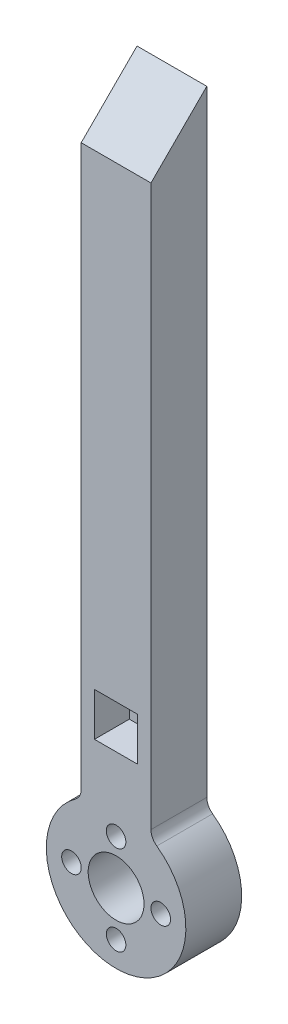
ISO-10303-21;
HEADER;
FILE_DESCRIPTION(('STEP AP214'),'2;1');
FILE_NAME('part.step','',(''),(''),'','','');
FILE_SCHEMA(('AUTOMOTIVE_DESIGN { 1 0 10303 214 1 1 1 1 }'));
ENDSEC;
DATA;
#1=APPLICATION_CONTEXT('core data for automotive mechanical design processes');
#2=APPLICATION_PROTOCOL_DEFINITION('international standard','automotive_design',2000,#1);
#3=PRODUCT_CONTEXT('',#1,'mechanical');
#4=PRODUCT('Part','Part','',(#3));
#5=PRODUCT_RELATED_PRODUCT_CATEGORY('part','',(#4));
#6=PRODUCT_DEFINITION_FORMATION('','',#4);
#7=PRODUCT_DEFINITION_CONTEXT('part definition',#1,'design');
#8=PRODUCT_DEFINITION('design','',#6,#7);
#9=PRODUCT_DEFINITION_SHAPE('','',#8);
#10=(LENGTH_UNIT() NAMED_UNIT(*) SI_UNIT(.MILLI.,.METRE.));
#11=(NAMED_UNIT(*) PLANE_ANGLE_UNIT() SI_UNIT($,.RADIAN.));
#12=(NAMED_UNIT(*) SI_UNIT($,.STERADIAN.) SOLID_ANGLE_UNIT());
#13=UNCERTAINTY_MEASURE_WITH_UNIT(LENGTH_MEASURE(1.E-05),#10,'distance_accuracy_value','');
#14=(GEOMETRIC_REPRESENTATION_CONTEXT(3) GLOBAL_UNCERTAINTY_ASSIGNED_CONTEXT((#13)) GLOBAL_UNIT_ASSIGNED_CONTEXT((#10,
#11,#12)) REPRESENTATION_CONTEXT('',''));
#15=CARTESIAN_POINT('',(0.,0.,0.));
#16=DIRECTION('',(0.,0.,1.));
#17=DIRECTION('',(1.,0.,0.));
#18=AXIS2_PLACEMENT_3D('',#15,#16,#17);
#19=CARTESIAN_POINT('',(0.,0.,10.16));
#20=DIRECTION('',(0.,0.,1.));
#21=DIRECTION('',(1.,0.,0.));
#22=AXIS2_PLACEMENT_3D('',#19,#20,#21);
#23=PLANE('',#22);
#24=DIRECTION('',(0.,1.,0.));
#25=VECTOR('',#24,1.);
#26=CARTESIAN_POINT('',(3.937,21.463,10.16));
#27=LINE('',#26,#25);
#28=CARTESIAN_POINT('',(3.937,21.463,10.16));
#29=VERTEX_POINT('',#28);
#30=CARTESIAN_POINT('',(3.937,29.337,10.16));
#31=VERTEX_POINT('',#30);
#32=EDGE_CURVE('E230',#29,#31,#27,.T.);
#33=ORIENTED_EDGE('',*,*,#32,.F.);
#34=DIRECTION('',(1.,0.,0.));
#35=VECTOR('',#34,1.);
#36=CARTESIAN_POINT('',(-3.937,21.463,10.16));
#37=LINE('',#36,#35);
#38=CARTESIAN_POINT('',(-3.937,21.463,10.16));
#39=VERTEX_POINT('',#38);
#40=EDGE_CURVE('E250',#39,#29,#37,.T.);
#41=ORIENTED_EDGE('',*,*,#40,.F.);
#42=DIRECTION('',(0.,-1.,0.));
#43=VECTOR('',#42,1.);
#44=CARTESIAN_POINT('',(-3.937,21.463,10.16));
#45=LINE('',#44,#43);
#46=CARTESIAN_POINT('',(-3.937,29.337,10.16));
#47=VERTEX_POINT('',#46);
#48=EDGE_CURVE('E254',#47,#39,#45,.T.);
#49=ORIENTED_EDGE('',*,*,#48,.F.);
#50=DIRECTION('',(-1.,0.,0.));
#51=VECTOR('',#50,1.);
#52=CARTESIAN_POINT('',(-3.937,29.337,10.16));
#53=LINE('',#52,#51);
#54=EDGE_CURVE('E263',#31,#47,#53,.T.);
#55=ORIENTED_EDGE('',*,*,#54,.F.);
#56=EDGE_LOOP('',(#33,#41,#49,#55));
#57=FACE_BOUND('',#56,.T.);
#58=CARTESIAN_POINT('',(8.128,0.,10.16));
#59=DIRECTION('',(0.,0.,1.));
#60=DIRECTION('',(1.,0.,0.));
#61=AXIS2_PLACEMENT_3D('',#58,#59,#60);
#62=CIRCLE('',#61,1.778);
#63=CARTESIAN_POINT('',(9.906,0.,10.16));
#64=VERTEX_POINT('',#63);
#65=EDGE_CURVE('E298',#64,#64,#62,.T.);
#66=ORIENTED_EDGE('',*,*,#65,.F.);
#67=EDGE_LOOP('',(#66));
#68=FACE_BOUND('',#67,.T.);
#69=CARTESIAN_POINT('',(1.61409540099723E-12,-8.128,10.16));
#70=DIRECTION('',(0.,0.,1.));
#71=DIRECTION('',(1.,0.,0.));
#72=AXIS2_PLACEMENT_3D('',#69,#70,#71);
#73=CIRCLE('',#72,1.7780000000016);
#74=CARTESIAN_POINT('',(1.77800000000321,-8.128,10.16));
#75=VERTEX_POINT('',#74);
#76=EDGE_CURVE('E314',#75,#75,#73,.T.);
#77=ORIENTED_EDGE('',*,*,#76,.F.);
#78=EDGE_LOOP('',(#77));
#79=FACE_BOUND('',#78,.T.);
#80=DIRECTION('',(0.,-1.,0.));
#81=VECTOR('',#80,1.);
#82=CARTESIAN_POINT('',(-6.35,12.7,10.16));
#83=LINE('',#82,#81);
#84=CARTESIAN_POINT('',(-6.35,114.3,10.16));
#85=VERTEX_POINT('',#84);
#86=CARTESIAN_POINT('',(-6.35,12.3784288179074,10.16));
#87=VERTEX_POINT('',#86);
#88=EDGE_CURVE('E330',#85,#87,#83,.T.);
#89=ORIENTED_EDGE('',*,*,#88,.T.);
#90=CARTESIAN_POINT('',(-8.89,12.3784288179074,10.16));
#91=DIRECTION('',(0.,0.,1.));
#92=DIRECTION('',(1.,0.,0.));
#93=AXIS2_PLACEMENT_3D('',#90,#91,#92);
#94=CIRCLE('',#93,2.54);
#95=CARTESIAN_POINT('',(-7.40833333333333,10.3153573482562,10.16));
#96=VERTEX_POINT('',#95);
#97=EDGE_CURVE('E12',#87,#96,#94,.F.);
#98=ORIENTED_EDGE('',*,*,#97,.T.);
#99=CARTESIAN_POINT('',(0.,0.,10.16));
#100=DIRECTION('',(0.,0.,1.));
#101=DIRECTION('',(1.,0.,0.));
#102=AXIS2_PLACEMENT_3D('',#99,#100,#101);
#103=CIRCLE('',#102,12.7);
#104=CARTESIAN_POINT('',(7.40833333333333,10.3153573482562,10.16));
#105=VERTEX_POINT('',#104);
#106=EDGE_CURVE('E333',#96,#105,#103,.T.);
#107=ORIENTED_EDGE('',*,*,#106,.T.);
#108=CARTESIAN_POINT('',(8.89,12.3784288179074,10.16));
#109=DIRECTION('',(0.,0.,1.));
#110=DIRECTION('',(1.,0.,0.));
#111=AXIS2_PLACEMENT_3D('',#108,#109,#110);
#112=CIRCLE('',#111,2.54);
#113=CARTESIAN_POINT('',(6.35,12.3784288179074,10.16));
#114=VERTEX_POINT('',#113);
#115=EDGE_CURVE('E370',#105,#114,#112,.F.);
#116=ORIENTED_EDGE('',*,*,#115,.T.);
#117=DIRECTION('',(0.,-1.,0.));
#118=VECTOR('',#117,1.);
#119=CARTESIAN_POINT('',(6.35,12.7,10.16));
#120=LINE('',#119,#118);
#121=CARTESIAN_POINT('',(6.35,114.3,10.16));
#122=VERTEX_POINT('',#121);
#123=EDGE_CURVE('E338',#122,#114,#120,.T.);
#124=ORIENTED_EDGE('',*,*,#123,.F.);
#125=DIRECTION('',(1.,0.,0.));
#126=VECTOR('',#125,1.);
#127=CARTESIAN_POINT('',(-6.35,114.3,10.16));
#128=LINE('',#127,#126);
#129=EDGE_CURVE('E342',#85,#122,#128,.T.);
#130=ORIENTED_EDGE('',*,*,#129,.F.);
#131=EDGE_LOOP('',(#89,#98,#107,#116,#124,#130));
#132=FACE_BOUND('',#131,.T.);
#133=CARTESIAN_POINT('',(0.,0.,10.16));
#134=DIRECTION('',(0.,0.,1.));
#135=DIRECTION('',(1.,0.,0.));
#136=AXIS2_PLACEMENT_3D('',#133,#134,#135);
#137=CIRCLE('',#136,5.08);
#138=CARTESIAN_POINT('',(5.08,0.,10.16));
#139=VERTEX_POINT('',#138);
#140=EDGE_CURVE('E322',#139,#139,#137,.T.);
#141=ORIENTED_EDGE('',*,*,#140,.F.);
#142=EDGE_LOOP('',(#141));
#143=FACE_BOUND('',#142,.T.);
#144=CARTESIAN_POINT('',(-8.128,0.,10.16));
#145=DIRECTION('',(0.,0.,1.));
#146=DIRECTION('',(1.,0.,0.));
#147=AXIS2_PLACEMENT_3D('',#144,#145,#146);
#148=CIRCLE('',#147,1.778);
#149=CARTESIAN_POINT('',(-6.35,0.,10.16));
#150=VERTEX_POINT('',#149);
#151=EDGE_CURVE('E306',#150,#150,#148,.T.);
#152=ORIENTED_EDGE('',*,*,#151,.F.);
#153=EDGE_LOOP('',(#152));
#154=FACE_BOUND('',#153,.T.);
#155=CARTESIAN_POINT('',(0.,8.128,10.16));
#156=DIRECTION('',(0.,0.,1.));
#157=DIRECTION('',(1.,0.,0.));
#158=AXIS2_PLACEMENT_3D('',#155,#156,#157);
#159=CIRCLE('',#158,1.778);
#160=CARTESIAN_POINT('',(1.778,8.128,10.16));
#161=VERTEX_POINT('',#160);
#162=EDGE_CURVE('E290',#161,#161,#159,.T.);
#163=ORIENTED_EDGE('',*,*,#162,.F.);
#164=EDGE_LOOP('',(#163));
#165=FACE_BOUND('',#164,.T.);
#166=ADVANCED_FACE('F147',(#57,#68,#79,#132,#143,#154,#165),#23,.T.);
#167=CARTESIAN_POINT('',(0.,0.,0.));
#168=DIRECTION('',(0.,0.,1.));
#169=DIRECTION('',(1.,0.,0.));
#170=AXIS2_PLACEMENT_3D('',#167,#168,#169);
#171=PLANE('',#170);
#172=CARTESIAN_POINT('',(0.,0.,0.));
#173=DIRECTION('',(0.,0.,1.));
#174=DIRECTION('',(1.,0.,0.));
#175=AXIS2_PLACEMENT_3D('',#172,#173,#174);
#176=CIRCLE('',#175,12.7);
#177=CARTESIAN_POINT('',(-7.40833333333333,10.3153573482562,0.));
#178=VERTEX_POINT('',#177);
#179=CARTESIAN_POINT('',(7.40833333333333,10.3153573482562,0.));
#180=VERTEX_POINT('',#179);
#181=EDGE_CURVE('E326',#178,#180,#176,.T.);
#182=ORIENTED_EDGE('',*,*,#181,.F.);
#183=CARTESIAN_POINT('',(-8.89,12.3784288179074,0.));
#184=DIRECTION('',(0.,0.,1.));
#185=DIRECTION('',(1.,0.,0.));
#186=AXIS2_PLACEMENT_3D('',#183,#184,#185);
#187=CIRCLE('',#186,2.54);
#188=CARTESIAN_POINT('',(-6.35,12.3784288179074,0.));
#189=VERTEX_POINT('',#188);
#190=EDGE_CURVE('E156',#178,#189,#187,.T.);
#191=ORIENTED_EDGE('',*,*,#190,.T.);
#192=DIRECTION('',(0.,1.,0.));
#193=VECTOR('',#192,1.);
#194=CARTESIAN_POINT('',(-6.35,12.7,0.));
#195=LINE('',#194,#193);
#196=CARTESIAN_POINT('',(-6.35,124.46,0.));
#197=VERTEX_POINT('',#196);
#198=EDGE_CURVE('E334',#189,#197,#195,.T.);
#199=ORIENTED_EDGE('',*,*,#198,.T.);
#200=DIRECTION('',(1.,0.,0.));
#201=VECTOR('',#200,1.);
#202=CARTESIAN_POINT('',(-20.7184097937106,124.46,0.));
#203=LINE('',#202,#201);
#204=CARTESIAN_POINT('',(6.35,124.46,0.));
#205=VERTEX_POINT('',#204);
#206=EDGE_CURVE('E281',#197,#205,#203,.T.);
#207=ORIENTED_EDGE('',*,*,#206,.T.);
#208=DIRECTION('',(0.,1.,0.));
#209=VECTOR('',#208,1.);
#210=CARTESIAN_POINT('',(6.35,12.7,0.));
#211=LINE('',#210,#209);
#212=CARTESIAN_POINT('',(6.35,12.3784288179074,0.));
#213=VERTEX_POINT('',#212);
#214=EDGE_CURVE('E350',#213,#205,#211,.T.);
#215=ORIENTED_EDGE('',*,*,#214,.F.);
#216=CARTESIAN_POINT('',(8.89,12.3784288179074,0.));
#217=DIRECTION('',(0.,0.,1.));
#218=DIRECTION('',(1.,0.,0.));
#219=AXIS2_PLACEMENT_3D('',#216,#217,#218);
#220=CIRCLE('',#219,2.54);
#221=EDGE_CURVE('E367',#213,#180,#220,.T.);
#222=ORIENTED_EDGE('',*,*,#221,.T.);
#223=EDGE_LOOP('',(#182,#191,#199,#207,#215,#222));
#224=FACE_BOUND('',#223,.T.);
#225=CARTESIAN_POINT('',(0.,0.,0.));
#226=DIRECTION('',(0.,0.,1.));
#227=DIRECTION('',(1.,0.,0.));
#228=AXIS2_PLACEMENT_3D('',#225,#226,#227);
#229=CIRCLE('',#228,5.08);
#230=CARTESIAN_POINT('',(5.08,0.,0.));
#231=VERTEX_POINT('',#230);
#232=EDGE_CURVE('E318',#231,#231,#229,.T.);
#233=ORIENTED_EDGE('',*,*,#232,.T.);
#234=EDGE_LOOP('',(#233));
#235=FACE_BOUND('',#234,.T.);
#236=CARTESIAN_POINT('',(1.61409540099723E-12,-8.128,0.));
#237=DIRECTION('',(0.,0.,1.));
#238=DIRECTION('',(1.,0.,0.));
#239=AXIS2_PLACEMENT_3D('',#236,#237,#238);
#240=CIRCLE('',#239,1.7780000000016);
#241=CARTESIAN_POINT('',(1.77800000000321,-8.128,0.));
#242=VERTEX_POINT('',#241);
#243=EDGE_CURVE('E310',#242,#242,#240,.T.);
#244=ORIENTED_EDGE('',*,*,#243,.T.);
#245=EDGE_LOOP('',(#244));
#246=FACE_BOUND('',#245,.T.);
#247=CARTESIAN_POINT('',(-8.128,0.,0.));
#248=DIRECTION('',(0.,0.,1.));
#249=DIRECTION('',(1.,0.,0.));
#250=AXIS2_PLACEMENT_3D('',#247,#248,#249);
#251=CIRCLE('',#250,1.778);
#252=CARTESIAN_POINT('',(-6.35,0.,0.));
#253=VERTEX_POINT('',#252);
#254=EDGE_CURVE('E302',#253,#253,#251,.T.);
#255=ORIENTED_EDGE('',*,*,#254,.T.);
#256=EDGE_LOOP('',(#255));
#257=FACE_BOUND('',#256,.T.);
#258=CARTESIAN_POINT('',(8.128,0.,0.));
#259=DIRECTION('',(0.,0.,1.));
#260=DIRECTION('',(1.,0.,0.));
#261=AXIS2_PLACEMENT_3D('',#258,#259,#260);
#262=CIRCLE('',#261,1.778);
#263=CARTESIAN_POINT('',(9.906,0.,0.));
#264=VERTEX_POINT('',#263);
#265=EDGE_CURVE('E294',#264,#264,#262,.T.);
#266=ORIENTED_EDGE('',*,*,#265,.T.);
#267=EDGE_LOOP('',(#266));
#268=FACE_BOUND('',#267,.T.);
#269=CARTESIAN_POINT('',(0.,8.128,0.));
#270=DIRECTION('',(0.,0.,1.));
#271=DIRECTION('',(1.,0.,0.));
#272=AXIS2_PLACEMENT_3D('',#269,#270,#271);
#273=CIRCLE('',#272,1.778);
#274=CARTESIAN_POINT('',(1.778,8.128,0.));
#275=VERTEX_POINT('',#274);
#276=EDGE_CURVE('E286',#275,#275,#273,.T.);
#277=ORIENTED_EDGE('',*,*,#276,.T.);
#278=EDGE_LOOP('',(#277));
#279=FACE_BOUND('',#278,.T.);
#280=ADVANCED_FACE('F386',(#224,#235,#246,#257,#268,#279),#171,.F.);
#281=CARTESIAN_POINT('',(0.,0.,10.16));
#282=DIRECTION('',(0.,0.,-1.));
#283=DIRECTION('',(-1.,0.,0.));
#284=AXIS2_PLACEMENT_3D('',#281,#282,#283);
#285=CYLINDRICAL_SURFACE('',#284,12.7);
#286=ORIENTED_EDGE('',*,*,#181,.T.);
#287=DIRECTION('',(0.,0.,-1.));
#288=VECTOR('',#287,1.);
#289=CARTESIAN_POINT('',(7.40833333333333,10.3153573482562,10.16));
#290=LINE('',#289,#288);
#291=EDGE_CURVE('E362',#180,#105,#290,.F.);
#292=ORIENTED_EDGE('',*,*,#291,.T.);
#293=ORIENTED_EDGE('',*,*,#106,.F.);
#294=DIRECTION('',(0.,0.,-1.));
#295=VECTOR('',#294,1.);
#296=CARTESIAN_POINT('',(-7.40833333333333,10.3153573482562,10.16));
#297=LINE('',#296,#295);
#298=EDGE_CURVE('E358',#96,#178,#297,.T.);
#299=ORIENTED_EDGE('',*,*,#298,.T.);
#300=EDGE_LOOP('',(#286,#292,#293,#299));
#301=FACE_BOUND('',#300,.T.);
#302=ADVANCED_FACE('F389',(#301),#285,.T.);
#303=CARTESIAN_POINT('',(6.35,12.7,10.16));
#304=DIRECTION('',(-1.,0.,0.));
#305=DIRECTION('',(0.,0.,1.));
#306=AXIS2_PLACEMENT_3D('',#303,#304,#305);
#307=PLANE('',#306);
#308=ORIENTED_EDGE('',*,*,#123,.T.);
#309=DIRECTION('',(0.,0.,1.));
#310=VECTOR('',#309,1.);
#311=CARTESIAN_POINT('',(6.35,12.3784288179074,0.));
#312=LINE('',#311,#310);
#313=EDGE_CURVE('E346',#114,#213,#312,.F.);
#314=ORIENTED_EDGE('',*,*,#313,.T.);
#315=ORIENTED_EDGE('',*,*,#214,.T.);
#316=DIRECTION('',(0.,0.707106781186548,-0.707106781186547));
#317=VECTOR('',#316,1.);
#318=CARTESIAN_POINT('',(6.35,124.46,0.));
#319=LINE('',#318,#317);
#320=EDGE_CURVE('E272',#122,#205,#319,.T.);
#321=ORIENTED_EDGE('',*,*,#320,.F.);
#322=EDGE_LOOP('',(#308,#314,#315,#321));
#323=FACE_BOUND('',#322,.T.);
#324=ADVANCED_FACE('F383',(#323),#307,.F.);
#325=CARTESIAN_POINT('',(-6.35,12.7,10.16));
#326=DIRECTION('',(-1.,0.,0.));
#327=DIRECTION('',(0.,0.,1.));
#328=AXIS2_PLACEMENT_3D('',#325,#326,#327);
#329=PLANE('',#328);
#330=ORIENTED_EDGE('',*,*,#198,.F.);
#331=DIRECTION('',(0.,0.,-1.));
#332=VECTOR('',#331,1.);
#333=CARTESIAN_POINT('',(-6.35,12.3784288179074,10.16));
#334=LINE('',#333,#332);
#335=EDGE_CURVE('E163',#189,#87,#334,.F.);
#336=ORIENTED_EDGE('',*,*,#335,.T.);
#337=ORIENTED_EDGE('',*,*,#88,.F.);
#338=DIRECTION('',(0.,0.707106781186548,-0.707106781186547));
#339=VECTOR('',#338,1.);
#340=CARTESIAN_POINT('',(-6.35,124.46,0.));
#341=LINE('',#340,#339);
#342=EDGE_CURVE('E282',#85,#197,#341,.T.);
#343=ORIENTED_EDGE('',*,*,#342,.T.);
#344=EDGE_LOOP('',(#330,#336,#337,#343));
#345=FACE_BOUND('',#344,.T.);
#346=ADVANCED_FACE('F394',(#345),#329,.T.);
#347=CARTESIAN_POINT('',(0.,0.,10.16));
#348=DIRECTION('',(0.,0.,-1.));
#349=DIRECTION('',(-1.,0.,0.));
#350=AXIS2_PLACEMENT_3D('',#347,#348,#349);
#351=CYLINDRICAL_SURFACE('',#350,5.08);
#352=ORIENTED_EDGE('',*,*,#140,.T.);
#353=EDGE_LOOP('',(#352));
#354=FACE_BOUND('',#353,.T.);
#355=ORIENTED_EDGE('',*,*,#232,.F.);
#356=EDGE_LOOP('',(#355));
#357=FACE_BOUND('',#356,.T.);
#358=ADVANCED_FACE('F419',(#354,#357),#351,.F.);
#359=CARTESIAN_POINT('',(1.61409540099723E-12,-8.128,10.16));
#360=DIRECTION('',(0.,0.,-1.));
#361=DIRECTION('',(-1.,0.,0.));
#362=AXIS2_PLACEMENT_3D('',#359,#360,#361);
#363=CYLINDRICAL_SURFACE('',#362,1.7780000000016);
#364=ORIENTED_EDGE('',*,*,#76,.T.);
#365=EDGE_LOOP('',(#364));
#366=FACE_BOUND('',#365,.T.);
#367=ORIENTED_EDGE('',*,*,#243,.F.);
#368=EDGE_LOOP('',(#367));
#369=FACE_BOUND('',#368,.T.);
#370=ADVANCED_FACE('F556',(#366,#369),#363,.F.);
#371=CARTESIAN_POINT('',(-8.128,0.,10.16));
#372=DIRECTION('',(0.,0.,-1.));
#373=DIRECTION('',(-1.,0.,0.));
#374=AXIS2_PLACEMENT_3D('',#371,#372,#373);
#375=CYLINDRICAL_SURFACE('',#374,1.778);
#376=ORIENTED_EDGE('',*,*,#151,.T.);
#377=EDGE_LOOP('',(#376));
#378=FACE_BOUND('',#377,.T.);
#379=ORIENTED_EDGE('',*,*,#254,.F.);
#380=EDGE_LOOP('',(#379));
#381=FACE_BOUND('',#380,.T.);
#382=ADVANCED_FACE('F546',(#378,#381),#375,.F.);
#383=CARTESIAN_POINT('',(8.128,0.,10.16));
#384=DIRECTION('',(0.,0.,-1.));
#385=DIRECTION('',(-1.,0.,0.));
#386=AXIS2_PLACEMENT_3D('',#383,#384,#385);
#387=CYLINDRICAL_SURFACE('',#386,1.778);
#388=ORIENTED_EDGE('',*,*,#65,.T.);
#389=EDGE_LOOP('',(#388));
#390=FACE_BOUND('',#389,.T.);
#391=ORIENTED_EDGE('',*,*,#265,.F.);
#392=EDGE_LOOP('',(#391));
#393=FACE_BOUND('',#392,.T.);
#394=ADVANCED_FACE('F407',(#390,#393),#387,.F.);
#395=CARTESIAN_POINT('',(0.,8.128,10.16));
#396=DIRECTION('',(0.,0.,-1.));
#397=DIRECTION('',(-1.,0.,0.));
#398=AXIS2_PLACEMENT_3D('',#395,#396,#397);
#399=CYLINDRICAL_SURFACE('',#398,1.778);
#400=ORIENTED_EDGE('',*,*,#162,.T.);
#401=EDGE_LOOP('',(#400));
#402=FACE_BOUND('',#401,.T.);
#403=ORIENTED_EDGE('',*,*,#276,.F.);
#404=EDGE_LOOP('',(#403));
#405=FACE_BOUND('',#404,.T.);
#406=ADVANCED_FACE('F399',(#402,#405),#399,.F.);
#407=CARTESIAN_POINT('',(-20.7184097937106,124.46,0.));
#408=DIRECTION('',(0.,-0.707106781186547,-0.707106781186548));
#409=DIRECTION('',(0.,0.707106781186548,-0.707106781186547));
#410=AXIS2_PLACEMENT_3D('',#407,#408,#409);
#411=PLANE('',#410);
#412=ORIENTED_EDGE('',*,*,#342,.F.);
#413=ORIENTED_EDGE('',*,*,#129,.T.);
#414=ORIENTED_EDGE('',*,*,#320,.T.);
#415=ORIENTED_EDGE('',*,*,#206,.F.);
#416=EDGE_LOOP('',(#412,#413,#414,#415));
#417=FACE_BOUND('',#416,.T.);
#418=ADVANCED_FACE('F397',(#417),#411,.F.);
#419=CARTESIAN_POINT('',(3.937,21.463,3.81));
#420=DIRECTION('',(1.,0.,0.));
#421=DIRECTION('',(0.,0.,-1.));
#422=AXIS2_PLACEMENT_3D('',#419,#420,#421);
#423=PLANE('',#422);
#424=ORIENTED_EDGE('',*,*,#32,.T.);
#425=DIRECTION('',(0.,0.,1.));
#426=VECTOR('',#425,1.);
#427=CARTESIAN_POINT('',(3.937,29.337,3.81));
#428=LINE('',#427,#426);
#429=CARTESIAN_POINT('',(3.937,29.337,3.81));
#430=VERTEX_POINT('',#429);
#431=EDGE_CURVE('E223',#430,#31,#428,.T.);
#432=ORIENTED_EDGE('',*,*,#431,.F.);
#433=DIRECTION('',(0.,1.,0.));
#434=VECTOR('',#433,1.);
#435=CARTESIAN_POINT('',(3.937,21.463,3.81));
#436=LINE('',#435,#434);
#437=CARTESIAN_POINT('',(3.937,21.463,3.81));
#438=VERTEX_POINT('',#437);
#439=EDGE_CURVE('E227',#438,#430,#436,.T.);
#440=ORIENTED_EDGE('',*,*,#439,.F.);
#441=DIRECTION('',(0.,0.,1.));
#442=VECTOR('',#441,1.);
#443=CARTESIAN_POINT('',(3.937,21.463,3.81));
#444=LINE('',#443,#442);
#445=EDGE_CURVE('E269',#438,#29,#444,.T.);
#446=ORIENTED_EDGE('',*,*,#445,.T.);
#447=EDGE_LOOP('',(#424,#432,#440,#446));
#448=FACE_BOUND('',#447,.T.);
#449=ADVANCED_FACE('F225',(#448),#423,.F.);
#450=CARTESIAN_POINT('',(-3.937,21.463,3.81));
#451=DIRECTION('',(0.,-1.,0.));
#452=DIRECTION('',(0.,0.,-1.));
#453=AXIS2_PLACEMENT_3D('',#450,#451,#452);
#454=PLANE('',#453);
#455=ORIENTED_EDGE('',*,*,#40,.T.);
#456=ORIENTED_EDGE('',*,*,#445,.F.);
#457=DIRECTION('',(1.,0.,0.));
#458=VECTOR('',#457,1.);
#459=CARTESIAN_POINT('',(-3.937,21.463,3.81));
#460=LINE('',#459,#458);
#461=CARTESIAN_POINT('',(-3.937,21.463,3.81));
#462=VERTEX_POINT('',#461);
#463=EDGE_CURVE('E236',#462,#438,#460,.T.);
#464=ORIENTED_EDGE('',*,*,#463,.F.);
#465=DIRECTION('',(0.,0.,1.));
#466=VECTOR('',#465,1.);
#467=CARTESIAN_POINT('',(-3.937,21.463,3.81));
#468=LINE('',#467,#466);
#469=EDGE_CURVE('E273',#462,#39,#468,.T.);
#470=ORIENTED_EDGE('',*,*,#469,.T.);
#471=EDGE_LOOP('',(#455,#456,#464,#470));
#472=FACE_BOUND('',#471,.T.);
#473=ADVANCED_FACE('F405',(#472),#454,.F.);
#474=CARTESIAN_POINT('',(-3.937,21.463,3.81));
#475=DIRECTION('',(-1.,0.,0.));
#476=DIRECTION('',(0.,0.,1.));
#477=AXIS2_PLACEMENT_3D('',#474,#475,#476);
#478=PLANE('',#477);
#479=ORIENTED_EDGE('',*,*,#48,.T.);
#480=ORIENTED_EDGE('',*,*,#469,.F.);
#481=DIRECTION('',(0.,-1.,0.));
#482=VECTOR('',#481,1.);
#483=CARTESIAN_POINT('',(-3.937,21.463,3.81));
#484=LINE('',#483,#482);
#485=CARTESIAN_POINT('',(-3.937,29.337,3.81));
#486=VERTEX_POINT('',#485);
#487=EDGE_CURVE('E245',#486,#462,#484,.T.);
#488=ORIENTED_EDGE('',*,*,#487,.F.);
#489=DIRECTION('',(0.,0.,1.));
#490=VECTOR('',#489,1.);
#491=CARTESIAN_POINT('',(-3.937,29.337,3.81));
#492=LINE('',#491,#490);
#493=EDGE_CURVE('E235',#486,#47,#492,.T.);
#494=ORIENTED_EDGE('',*,*,#493,.T.);
#495=EDGE_LOOP('',(#479,#480,#488,#494));
#496=FACE_BOUND('',#495,.T.);
#497=ADVANCED_FACE('F436',(#496),#478,.F.);
#498=CARTESIAN_POINT('',(-3.937,29.337,3.81));
#499=DIRECTION('',(0.,1.,0.));
#500=DIRECTION('',(0.,0.,1.));
#501=AXIS2_PLACEMENT_3D('',#498,#499,#500);
#502=PLANE('',#501);
#503=ORIENTED_EDGE('',*,*,#54,.T.);
#504=ORIENTED_EDGE('',*,*,#493,.F.);
#505=DIRECTION('',(-1.,0.,0.));
#506=VECTOR('',#505,1.);
#507=CARTESIAN_POINT('',(-3.937,29.337,3.81));
#508=LINE('',#507,#506);
#509=EDGE_CURVE('E239',#430,#486,#508,.T.);
#510=ORIENTED_EDGE('',*,*,#509,.F.);
#511=ORIENTED_EDGE('',*,*,#431,.T.);
#512=EDGE_LOOP('',(#503,#504,#510,#511));
#513=FACE_BOUND('',#512,.T.);
#514=ADVANCED_FACE('F240',(#513),#502,.F.);
#515=CARTESIAN_POINT('',(0.,0.,3.81));
#516=DIRECTION('',(0.,0.,-1.));
#517=DIRECTION('',(-1.,0.,0.));
#518=AXIS2_PLACEMENT_3D('',#515,#516,#517);
#519=PLANE('',#518);
#520=ORIENTED_EDGE('',*,*,#439,.T.);
#521=ORIENTED_EDGE('',*,*,#509,.T.);
#522=ORIENTED_EDGE('',*,*,#487,.T.);
#523=ORIENTED_EDGE('',*,*,#463,.T.);
#524=EDGE_LOOP('',(#520,#521,#522,#523));
#525=FACE_BOUND('',#524,.T.);
#526=ADVANCED_FACE('F247',(#525),#519,.F.);
#527=CARTESIAN_POINT('',(8.89,12.3784288179074,10.16));
#528=DIRECTION('',(0.,0.,-1.));
#529=DIRECTION('',(-1.,0.,0.));
#530=AXIS2_PLACEMENT_3D('',#527,#528,#529);
#531=CYLINDRICAL_SURFACE('',#530,2.54);
#532=ORIENTED_EDGE('',*,*,#115,.F.);
#533=ORIENTED_EDGE('',*,*,#291,.F.);
#534=ORIENTED_EDGE('',*,*,#221,.F.);
#535=ORIENTED_EDGE('',*,*,#313,.F.);
#536=EDGE_LOOP('',(#532,#533,#534,#535));
#537=FACE_BOUND('',#536,.T.);
#538=ADVANCED_FACE('F385',(#537),#531,.F.);
#539=CARTESIAN_POINT('',(-8.89,12.3784288179074,10.16));
#540=DIRECTION('',(0.,0.,-1.));
#541=DIRECTION('',(-1.,0.,0.));
#542=AXIS2_PLACEMENT_3D('',#539,#540,#541);
#543=CYLINDRICAL_SURFACE('',#542,2.54);
#544=ORIENTED_EDGE('',*,*,#97,.F.);
#545=ORIENTED_EDGE('',*,*,#335,.F.);
#546=ORIENTED_EDGE('',*,*,#190,.F.);
#547=ORIENTED_EDGE('',*,*,#298,.F.);
#548=EDGE_LOOP('',(#544,#545,#546,#547));
#549=FACE_BOUND('',#548,.T.);
#550=ADVANCED_FACE('F149',(#549),#543,.F.);
#551=CLOSED_SHELL('',(#166,#280,#302,#324,#346,#358,#370,#382,#394,#406,#418,#449,#473,#497,
#514,#526,#538,#550));
#552=MANIFOLD_SOLID_BREP('B2',#551);
#553=ADVANCED_BREP_SHAPE_REPRESENTATION('',(#18,#552),#14);
#554=SHAPE_DEFINITION_REPRESENTATION(#9,#553);
ENDSEC;
END-ISO-10303-21;
